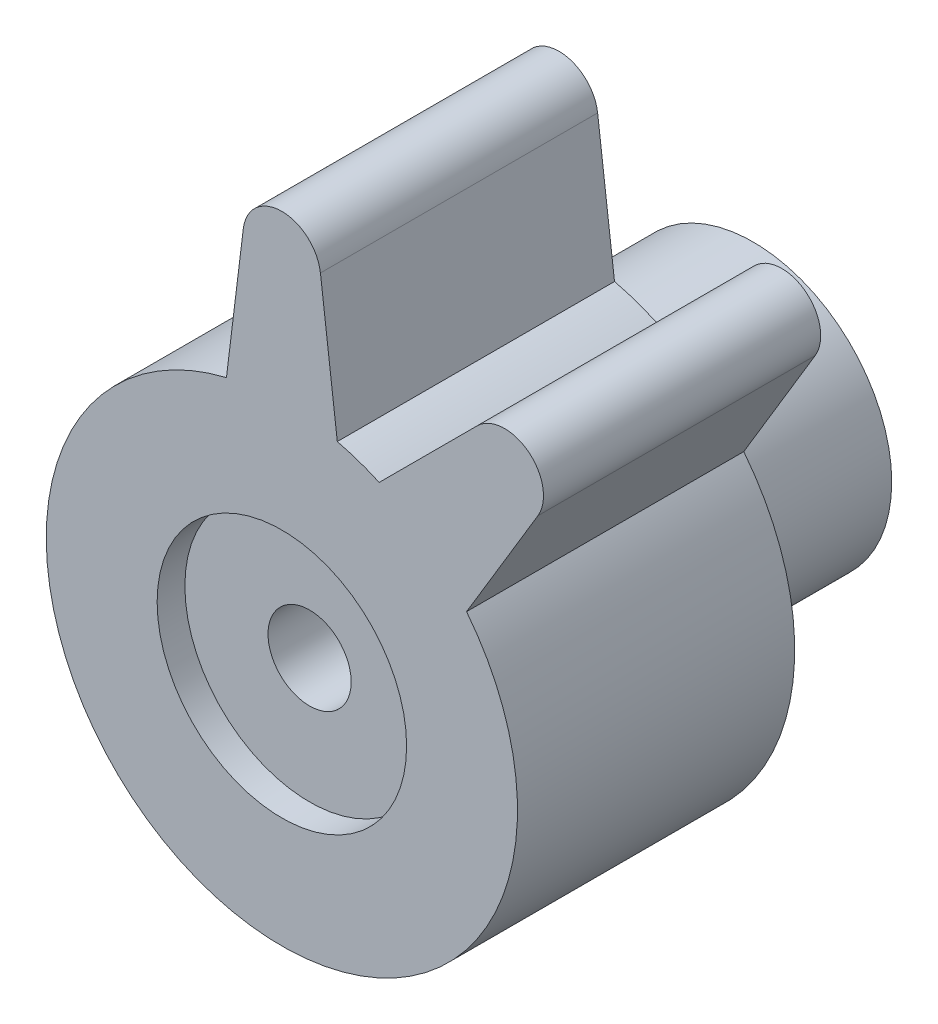
ISO-10303-21;
HEADER;
FILE_DESCRIPTION(('STEP AP214'),'2;1');
FILE_NAME('part.step','',(''),(''),'','','');
FILE_SCHEMA(('AUTOMOTIVE_DESIGN { 1 0 10303 214 1 1 1 1 }'));
ENDSEC;
DATA;
#1=APPLICATION_CONTEXT('core data for automotive mechanical design processes');
#2=APPLICATION_PROTOCOL_DEFINITION('international standard','automotive_design',2000,#1);
#3=PRODUCT_CONTEXT('',#1,'mechanical');
#4=PRODUCT('Part','Part','',(#3));
#5=PRODUCT_RELATED_PRODUCT_CATEGORY('part','',(#4));
#6=PRODUCT_DEFINITION_FORMATION('','',#4);
#7=PRODUCT_DEFINITION_CONTEXT('part definition',#1,'design');
#8=PRODUCT_DEFINITION('design','',#6,#7);
#9=PRODUCT_DEFINITION_SHAPE('','',#8);
#10=(LENGTH_UNIT() NAMED_UNIT(*) SI_UNIT(.MILLI.,.METRE.));
#11=(NAMED_UNIT(*) PLANE_ANGLE_UNIT() SI_UNIT($,.RADIAN.));
#12=(NAMED_UNIT(*) SI_UNIT($,.STERADIAN.) SOLID_ANGLE_UNIT());
#13=UNCERTAINTY_MEASURE_WITH_UNIT(LENGTH_MEASURE(1.E-05),#10,'distance_accuracy_value','');
#14=(GEOMETRIC_REPRESENTATION_CONTEXT(3) GLOBAL_UNCERTAINTY_ASSIGNED_CONTEXT((#13)) GLOBAL_UNIT_ASSIGNED_CONTEXT((#10,
#11,#12)) REPRESENTATION_CONTEXT('',''));
#15=CARTESIAN_POINT('',(0.,0.,0.));
#16=DIRECTION('',(0.,0.,1.));
#17=DIRECTION('',(1.,0.,0.));
#18=AXIS2_PLACEMENT_3D('',#15,#16,#17);
#19=CARTESIAN_POINT('',(0.,0.,10.));
#20=DIRECTION('',(0.,0.,-1.));
#21=DIRECTION('',(-1.,0.,0.));
#22=AXIS2_PLACEMENT_3D('',#19,#20,#21);
#23=CYLINDRICAL_SURFACE('',#22,1.5);
#24=CARTESIAN_POINT('',(0.,0.,0.));
#25=DIRECTION('',(0.,0.,1.));
#26=DIRECTION('',(1.,0.,0.));
#27=AXIS2_PLACEMENT_3D('',#24,#25,#26);
#28=CIRCLE('',#27,1.5);
#29=CARTESIAN_POINT('',(1.5,0.,0.));
#30=VERTEX_POINT('',#29);
#31=EDGE_CURVE('E149',#30,#30,#28,.T.);
#32=ORIENTED_EDGE('',*,*,#31,.F.);
#33=EDGE_LOOP('',(#32));
#34=FACE_BOUND('',#33,.T.);
#35=CARTESIAN_POINT('',(0.,0.,9.));
#36=DIRECTION('',(0.,0.,1.));
#37=DIRECTION('',(1.,0.,0.));
#38=AXIS2_PLACEMENT_3D('',#35,#36,#37);
#39=CIRCLE('',#38,1.5);
#40=CARTESIAN_POINT('',(1.5,0.,9.));
#41=VERTEX_POINT('',#40);
#42=EDGE_CURVE('E40',#41,#41,#39,.T.);
#43=ORIENTED_EDGE('',*,*,#42,.T.);
#44=EDGE_LOOP('',(#43));
#45=FACE_BOUND('',#44,.T.);
#46=ADVANCED_FACE('F37',(#34,#45),#23,.F.);
#47=CARTESIAN_POINT('',(0.,0.,0.));
#48=DIRECTION('',(0.,0.,1.));
#49=DIRECTION('',(1.,0.,0.));
#50=AXIS2_PLACEMENT_3D('',#47,#48,#49);
#51=PLANE('',#50);
#52=ORIENTED_EDGE('',*,*,#31,.T.);
#53=EDGE_LOOP('',(#52));
#54=FACE_BOUND('',#53,.T.);
#55=DIRECTION('',(1.,0.,0.));
#56=VECTOR('',#55,1.);
#57=CARTESIAN_POINT('',(0.,-2.6,0.));
#58=LINE('',#57,#56);
#59=CARTESIAN_POINT('',(-1.95,-2.6,0.));
#60=VERTEX_POINT('',#59);
#61=CARTESIAN_POINT('',(1.95,-2.6,0.));
#62=VERTEX_POINT('',#61);
#63=EDGE_CURVE('E51',#60,#62,#58,.T.);
#64=ORIENTED_EDGE('',*,*,#63,.F.);
#65=CARTESIAN_POINT('',(0.,0.,0.));
#66=DIRECTION('',(0.,0.,-1.));
#67=DIRECTION('',(-1.,0.,0.));
#68=AXIS2_PLACEMENT_3D('',#65,#66,#67);
#69=CIRCLE('',#68,3.25);
#70=EDGE_CURVE('E211',#60,#62,#69,.T.);
#71=ORIENTED_EDGE('',*,*,#70,.T.);
#72=EDGE_LOOP('',(#64,#71));
#73=FACE_BOUND('',#72,.T.);
#74=ADVANCED_FACE('F242',(#54,#73),#51,.F.);
#75=CARTESIAN_POINT('',(0.,0.,10.));
#76=DIRECTION('',(0.,0.,-1.));
#77=DIRECTION('',(-1.,0.,0.));
#78=AXIS2_PLACEMENT_3D('',#75,#76,#77);
#79=CYLINDRICAL_SURFACE('',#78,8.5);
#80=CARTESIAN_POINT('',(0.,0.,0.));
#81=DIRECTION('',(0.,0.,1.));
#82=DIRECTION('',(1.,0.,0.));
#83=AXIS2_PLACEMENT_3D('',#80,#81,#82);
#84=CIRCLE('',#83,8.5);
#85=CARTESIAN_POINT('',(-2.,8.26135582092915,0.));
#86=VERTEX_POINT('',#85);
#87=CARTESIAN_POINT('',(6.66222002011691,5.27871427561234,0.));
#88=VERTEX_POINT('',#87);
#89=EDGE_CURVE('E152',#86,#88,#84,.T.);
#90=ORIENTED_EDGE('',*,*,#89,.T.);
#91=DIRECTION('',(0.,0.,-1.));
#92=VECTOR('',#91,1.);
#93=CARTESIAN_POINT('',(6.66222002011691,5.27871427561234,10.));
#94=LINE('',#93,#92);
#95=CARTESIAN_POINT('',(6.66222002011691,5.27871427561234,10.));
#96=VERTEX_POINT('',#95);
#97=EDGE_CURVE('E45',#96,#88,#94,.T.);
#98=ORIENTED_EDGE('',*,*,#97,.F.);
#99=CARTESIAN_POINT('',(0.,0.,10.));
#100=DIRECTION('',(0.,0.,1.));
#101=DIRECTION('',(1.,0.,0.));
#102=AXIS2_PLACEMENT_3D('',#99,#100,#101);
#103=CIRCLE('',#102,8.5);
#104=CARTESIAN_POINT('',(-2.,8.26135582092915,10.));
#105=VERTEX_POINT('',#104);
#106=EDGE_CURVE('E170',#105,#96,#103,.T.);
#107=ORIENTED_EDGE('',*,*,#106,.F.);
#108=DIRECTION('',(0.,0.,-1.));
#109=VECTOR('',#108,1.);
#110=CARTESIAN_POINT('',(-2.,8.26135582092915,10.));
#111=LINE('',#110,#109);
#112=EDGE_CURVE('E60',#105,#86,#111,.T.);
#113=ORIENTED_EDGE('',*,*,#112,.T.);
#114=EDGE_LOOP('',(#90,#98,#107,#113));
#115=FACE_BOUND('',#114,.T.);
#116=ADVANCED_FACE('F183',(#115),#79,.T.);
#117=CARTESIAN_POINT('',(2.56455740077132,-1.54094154735917,10.));
#118=DIRECTION('',(-0.857167300702111,0.515038074910056,0.));
#119=DIRECTION('',(-0.515038074910056,-0.857167300702112,0.));
#120=AXIS2_PLACEMENT_3D('',#117,#118,#119);
#121=PLANE('',#120);
#122=DIRECTION('',(0.515038074910056,0.857167300702112,0.));
#123=VECTOR('',#122,1.);
#124=CARTESIAN_POINT('',(2.56455740077132,-1.54094154735917,0.));
#125=LINE('',#124,#123);
#126=CARTESIAN_POINT('',(9.23741039466719,9.56455077912289,0.));
#127=VERTEX_POINT('',#126);
#128=EDGE_CURVE('E155',#88,#127,#125,.T.);
#129=ORIENTED_EDGE('',*,*,#128,.T.);
#130=DIRECTION('',(0.,0.,-1.));
#131=VECTOR('',#130,1.);
#132=CARTESIAN_POINT('',(9.23741039466719,9.56455077912289,10.));
#133=LINE('',#132,#131);
#134=CARTESIAN_POINT('',(9.23741039466719,9.56455077912289,10.));
#135=VERTEX_POINT('',#134);
#136=EDGE_CURVE('E178',#135,#127,#133,.T.);
#137=ORIENTED_EDGE('',*,*,#136,.F.);
#138=DIRECTION('',(0.515038074910056,0.857167300702112,0.));
#139=VECTOR('',#138,1.);
#140=CARTESIAN_POINT('',(2.56455740077132,-1.54094154735917,10.));
#141=LINE('',#140,#139);
#142=EDGE_CURVE('E100',#96,#135,#141,.T.);
#143=ORIENTED_EDGE('',*,*,#142,.F.);
#144=ORIENTED_EDGE('',*,*,#97,.T.);
#145=EDGE_LOOP('',(#129,#137,#143,#144));
#146=FACE_BOUND('',#145,.T.);
#147=ADVANCED_FACE('F182',(#146),#121,.F.);
#148=CARTESIAN_POINT('',(8.03643599281354,10.2861690016569,10.));
#149=DIRECTION('',(0.,0.,-1.));
#150=DIRECTION('',(-1.,0.,0.));
#151=AXIS2_PLACEMENT_3D('',#148,#149,#150);
#152=CYLINDRICAL_SURFACE('',#151,1.40109684640317);
#153=CARTESIAN_POINT('',(8.03643599281354,10.2861690016569,0.));
#154=DIRECTION('',(0.,0.,1.));
#155=DIRECTION('',(1.,0.,0.));
#156=AXIS2_PLACEMENT_3D('',#153,#154,#155);
#157=CIRCLE('',#156,1.40109684640317);
#158=CARTESIAN_POINT('',(7.04571091162277,11.2768940828477,0.));
#159=VERTEX_POINT('',#158);
#160=EDGE_CURVE('E158',#127,#159,#157,.T.);
#161=ORIENTED_EDGE('',*,*,#160,.T.);
#162=DIRECTION('',(0.,0.,-1.));
#163=VECTOR('',#162,1.);
#164=CARTESIAN_POINT('',(7.04571091162277,11.2768940828477,10.));
#165=LINE('',#164,#163);
#166=CARTESIAN_POINT('',(7.04571091162277,11.2768940828477,10.));
#167=VERTEX_POINT('',#166);
#168=EDGE_CURVE('E176',#167,#159,#165,.T.);
#169=ORIENTED_EDGE('',*,*,#168,.F.);
#170=CARTESIAN_POINT('',(8.03643599281354,10.2861690016569,10.));
#171=DIRECTION('',(0.,0.,1.));
#172=DIRECTION('',(1.,0.,0.));
#173=AXIS2_PLACEMENT_3D('',#170,#171,#172);
#174=CIRCLE('',#173,1.40109684640317);
#175=EDGE_CURVE('E199',#135,#167,#174,.T.);
#176=ORIENTED_EDGE('',*,*,#175,.F.);
#177=ORIENTED_EDGE('',*,*,#136,.T.);
#178=EDGE_LOOP('',(#161,#169,#176,#177));
#179=FACE_BOUND('',#178,.T.);
#180=ADVANCED_FACE('F198',(#179),#152,.T.);
#181=CARTESIAN_POINT('',(-2.11559158561248,2.11559158561249,10.));
#182=DIRECTION('',(-0.707106781186546,0.707106781186549,0.));
#183=DIRECTION('',(-0.707106781186549,-0.707106781186546,0.));
#184=AXIS2_PLACEMENT_3D('',#181,#182,#183);
#185=PLANE('',#184);
#186=DIRECTION('',(0.707106781186549,0.707106781186546,0.));
#187=VECTOR('',#186,1.);
#188=CARTESIAN_POINT('',(-2.11559158561248,2.11559158561249,0.));
#189=LINE('',#188,#187);
#190=CARTESIAN_POINT('',(3.51017700569002,7.74136017691497,0.));
#191=VERTEX_POINT('',#190);
#192=EDGE_CURVE('E161',#191,#159,#189,.T.);
#193=ORIENTED_EDGE('',*,*,#192,.F.);
#194=DIRECTION('',(0.,0.,-1.));
#195=VECTOR('',#194,1.);
#196=CARTESIAN_POINT('',(3.51017700569002,7.74136017691497,10.));
#197=LINE('',#196,#195);
#198=CARTESIAN_POINT('',(3.51017700569002,7.74136017691497,10.));
#199=VERTEX_POINT('',#198);
#200=EDGE_CURVE('E174',#199,#191,#197,.T.);
#201=ORIENTED_EDGE('',*,*,#200,.F.);
#202=DIRECTION('',(0.707106781186549,0.707106781186546,0.));
#203=VECTOR('',#202,1.);
#204=CARTESIAN_POINT('',(-2.11559158561248,2.11559158561249,10.));
#205=LINE('',#204,#203);
#206=EDGE_CURVE('E195',#199,#167,#205,.T.);
#207=ORIENTED_EDGE('',*,*,#206,.T.);
#208=ORIENTED_EDGE('',*,*,#168,.T.);
#209=EDGE_LOOP('',(#193,#201,#207,#208));
#210=FACE_BOUND('',#209,.T.);
#211=ADVANCED_FACE('F192',(#210),#185,.T.);
#212=CARTESIAN_POINT('',(2.,8.26135582092915,0.));
#213=VERTEX_POINT('',#212);
#214=EDGE_CURVE('E156',#191,#213,#84,.T.);
#215=ORIENTED_EDGE('',*,*,#214,.T.);
#216=DIRECTION('',(0.,0.,-1.));
#217=VECTOR('',#216,1.);
#218=CARTESIAN_POINT('',(2.,8.26135582092915,10.));
#219=LINE('',#218,#217);
#220=CARTESIAN_POINT('',(2.,8.26135582092915,10.));
#221=VERTEX_POINT('',#220);
#222=EDGE_CURVE('E140',#221,#213,#219,.T.);
#223=ORIENTED_EDGE('',*,*,#222,.F.);
#224=EDGE_CURVE('E127',#199,#221,#103,.T.);
#225=ORIENTED_EDGE('',*,*,#224,.F.);
#226=ORIENTED_EDGE('',*,*,#200,.T.);
#227=EDGE_LOOP('',(#215,#223,#225,#226));
#228=FACE_BOUND('',#227,.T.);
#229=ADVANCED_FACE('F254',(#228),#79,.T.);
#230=CARTESIAN_POINT('',(2.96959715648726,0.364620682917803,10.));
#231=DIRECTION('',(-0.992546151641322,-0.121869343405148,0.));
#232=DIRECTION('',(0.121869343405148,-0.992546151641322,0.));
#233=AXIS2_PLACEMENT_3D('',#230,#231,#232);
#234=PLANE('',#233);
#235=DIRECTION('',(-0.121869343405148,0.992546151641322,0.));
#236=VECTOR('',#235,1.);
#237=CARTESIAN_POINT('',(2.96959715648726,0.364620682917803,0.));
#238=LINE('',#237,#236);
#239=CARTESIAN_POINT('',(1.39065328297426,13.2240865791358,0.));
#240=VERTEX_POINT('',#239);
#241=EDGE_CURVE('E136',#213,#240,#238,.T.);
#242=ORIENTED_EDGE('',*,*,#241,.T.);
#243=DIRECTION('',(0.,0.,-1.));
#244=VECTOR('',#243,1.);
#245=CARTESIAN_POINT('',(1.39065328297426,13.2240865791358,10.));
#246=LINE('',#245,#244);
#247=CARTESIAN_POINT('',(1.39065328297426,13.2240865791358,10.));
#248=VERTEX_POINT('',#247);
#249=EDGE_CURVE('E133',#248,#240,#246,.T.);
#250=ORIENTED_EDGE('',*,*,#249,.F.);
#251=DIRECTION('',(-0.121869343405148,0.992546151641322,0.));
#252=VECTOR('',#251,1.);
#253=CARTESIAN_POINT('',(2.96959715648726,0.364620682917803,10.));
#254=LINE('',#253,#252);
#255=EDGE_CURVE('E119',#221,#248,#254,.T.);
#256=ORIENTED_EDGE('',*,*,#255,.F.);
#257=ORIENTED_EDGE('',*,*,#222,.T.);
#258=EDGE_LOOP('',(#242,#250,#256,#257));
#259=FACE_BOUND('',#258,.T.);
#260=ADVANCED_FACE('F134',(#259),#234,.F.);
#261=CARTESIAN_POINT('',(0.,13.0533358264176,10.));
#262=DIRECTION('',(0.,0.,-1.));
#263=DIRECTION('',(-1.,0.,0.));
#264=AXIS2_PLACEMENT_3D('',#261,#262,#263);
#265=CYLINDRICAL_SURFACE('',#264,1.40109684640317);
#266=CARTESIAN_POINT('',(0.,13.0533358264176,0.));
#267=DIRECTION('',(0.,0.,1.));
#268=DIRECTION('',(1.,0.,0.));
#269=AXIS2_PLACEMENT_3D('',#266,#267,#268);
#270=CIRCLE('',#269,1.40109684640317);
#271=CARTESIAN_POINT('',(-1.39065328297426,13.2240865791358,0.));
#272=VERTEX_POINT('',#271);
#273=EDGE_CURVE('E165',#272,#240,#270,.F.);
#274=ORIENTED_EDGE('',*,*,#273,.F.);
#275=DIRECTION('',(0.,0.,-1.));
#276=VECTOR('',#275,1.);
#277=CARTESIAN_POINT('',(-1.39065328297426,13.2240865791358,10.));
#278=LINE('',#277,#276);
#279=CARTESIAN_POINT('',(-1.39065328297426,13.2240865791358,10.));
#280=VERTEX_POINT('',#279);
#281=EDGE_CURVE('E141',#280,#272,#278,.T.);
#282=ORIENTED_EDGE('',*,*,#281,.F.);
#283=CARTESIAN_POINT('',(0.,13.0533358264176,10.));
#284=DIRECTION('',(0.,0.,1.));
#285=DIRECTION('',(1.,0.,0.));
#286=AXIS2_PLACEMENT_3D('',#283,#284,#285);
#287=CIRCLE('',#286,1.40109684640317);
#288=EDGE_CURVE('E124',#280,#248,#287,.F.);
#289=ORIENTED_EDGE('',*,*,#288,.T.);
#290=ORIENTED_EDGE('',*,*,#249,.T.);
#291=EDGE_LOOP('',(#274,#282,#289,#290));
#292=FACE_BOUND('',#291,.T.);
#293=ADVANCED_FACE('F143',(#292),#265,.T.);
#294=CARTESIAN_POINT('',(-2.96959715648726,0.364620682917804,10.));
#295=DIRECTION('',(-0.992546151641322,0.121869343405148,0.));
#296=DIRECTION('',(-0.121869343405148,-0.992546151641322,0.));
#297=AXIS2_PLACEMENT_3D('',#294,#295,#296);
#298=PLANE('',#297);
#299=DIRECTION('',(0.121869343405148,0.992546151641322,0.));
#300=VECTOR('',#299,1.);
#301=CARTESIAN_POINT('',(-2.96959715648726,0.364620682917804,0.));
#302=LINE('',#301,#300);
#303=EDGE_CURVE('E167',#86,#272,#302,.T.);
#304=ORIENTED_EDGE('',*,*,#303,.F.);
#305=ORIENTED_EDGE('',*,*,#112,.F.);
#306=DIRECTION('',(0.121869343405148,0.992546151641322,0.));
#307=VECTOR('',#306,1.);
#308=CARTESIAN_POINT('',(-2.96959715648726,0.364620682917804,10.));
#309=LINE('',#308,#307);
#310=EDGE_CURVE('E144',#105,#280,#309,.T.);
#311=ORIENTED_EDGE('',*,*,#310,.T.);
#312=ORIENTED_EDGE('',*,*,#281,.T.);
#313=EDGE_LOOP('',(#304,#305,#311,#312));
#314=FACE_BOUND('',#313,.T.);
#315=ADVANCED_FACE('F187',(#314),#298,.T.);
#316=CARTESIAN_POINT('',(0.,0.,10.));
#317=DIRECTION('',(0.,0.,1.));
#318=DIRECTION('',(1.,0.,0.));
#319=AXIS2_PLACEMENT_3D('',#316,#317,#318);
#320=PLANE('',#319);
#321=CARTESIAN_POINT('',(0.,0.,10.));
#322=DIRECTION('',(0.,0.,1.));
#323=DIRECTION('',(1.,0.,0.));
#324=AXIS2_PLACEMENT_3D('',#321,#322,#323);
#325=CIRCLE('',#324,4.5);
#326=CARTESIAN_POINT('',(4.5,0.,10.));
#327=VERTEX_POINT('',#326);
#328=EDGE_CURVE('E220',#327,#327,#325,.T.);
#329=ORIENTED_EDGE('',*,*,#328,.F.);
#330=EDGE_LOOP('',(#329));
#331=FACE_BOUND('',#330,.T.);
#332=ORIENTED_EDGE('',*,*,#106,.T.);
#333=ORIENTED_EDGE('',*,*,#142,.T.);
#334=ORIENTED_EDGE('',*,*,#175,.T.);
#335=ORIENTED_EDGE('',*,*,#206,.F.);
#336=ORIENTED_EDGE('',*,*,#224,.T.);
#337=ORIENTED_EDGE('',*,*,#255,.T.);
#338=ORIENTED_EDGE('',*,*,#288,.F.);
#339=ORIENTED_EDGE('',*,*,#310,.F.);
#340=EDGE_LOOP('',(#332,#333,#334,#335,#336,#337,#338,#339));
#341=FACE_BOUND('',#340,.T.);
#342=ADVANCED_FACE('F121',(#331,#341),#320,.T.);
#343=CARTESIAN_POINT('',(0.,0.,0.));
#344=DIRECTION('',(0.,0.,1.));
#345=DIRECTION('',(1.,0.,0.));
#346=AXIS2_PLACEMENT_3D('',#343,#344,#345);
#347=CIRCLE('',#346,5.);
#348=CARTESIAN_POINT('',(5.,0.,0.));
#349=VERTEX_POINT('',#348);
#350=EDGE_CURVE('E11',#349,#349,#347,.F.);
#351=ORIENTED_EDGE('',*,*,#350,.F.);
#352=EDGE_LOOP('',(#351));
#353=FACE_BOUND('',#352,.T.);
#354=ORIENTED_EDGE('',*,*,#89,.F.);
#355=ORIENTED_EDGE('',*,*,#303,.T.);
#356=ORIENTED_EDGE('',*,*,#273,.T.);
#357=ORIENTED_EDGE('',*,*,#241,.F.);
#358=ORIENTED_EDGE('',*,*,#214,.F.);
#359=ORIENTED_EDGE('',*,*,#192,.T.);
#360=ORIENTED_EDGE('',*,*,#160,.F.);
#361=ORIENTED_EDGE('',*,*,#128,.F.);
#362=EDGE_LOOP('',(#354,#355,#356,#357,#358,#359,#360,#361));
#363=FACE_BOUND('',#362,.T.);
#364=ADVANCED_FACE('F185',(#353,#363),#51,.F.);
#365=CARTESIAN_POINT('',(0.,0.,-7.));
#366=DIRECTION('',(0.,0.,1.));
#367=DIRECTION('',(1.,0.,0.));
#368=AXIS2_PLACEMENT_3D('',#365,#366,#367);
#369=CYLINDRICAL_SURFACE('',#368,3.25);
#370=ORIENTED_EDGE('',*,*,#70,.F.);
#371=DIRECTION('',(0.,0.,1.));
#372=VECTOR('',#371,1.);
#373=CARTESIAN_POINT('',(-1.95,-2.6,-7.));
#374=LINE('',#373,#372);
#375=CARTESIAN_POINT('',(-1.95,-2.6,-7.));
#376=VERTEX_POINT('',#375);
#377=EDGE_CURVE('E153',#376,#60,#374,.T.);
#378=ORIENTED_EDGE('',*,*,#377,.F.);
#379=CARTESIAN_POINT('',(0.,0.,-7.));
#380=DIRECTION('',(0.,0.,-1.));
#381=DIRECTION('',(-1.,0.,0.));
#382=AXIS2_PLACEMENT_3D('',#379,#380,#381);
#383=CIRCLE('',#382,3.25);
#384=CARTESIAN_POINT('',(1.95,-2.6,-7.));
#385=VERTEX_POINT('',#384);
#386=EDGE_CURVE('E210',#376,#385,#383,.T.);
#387=ORIENTED_EDGE('',*,*,#386,.T.);
#388=DIRECTION('',(0.,0.,1.));
#389=VECTOR('',#388,1.);
#390=CARTESIAN_POINT('',(1.95,-2.6,-7.));
#391=LINE('',#390,#389);
#392=EDGE_CURVE('E205',#385,#62,#391,.T.);
#393=ORIENTED_EDGE('',*,*,#392,.T.);
#394=EDGE_LOOP('',(#370,#378,#387,#393));
#395=FACE_BOUND('',#394,.T.);
#396=ADVANCED_FACE('F258',(#395),#369,.F.);
#397=CARTESIAN_POINT('',(0.,-2.6,-7.));
#398=DIRECTION('',(0.,-1.,0.));
#399=DIRECTION('',(0.,0.,-1.));
#400=AXIS2_PLACEMENT_3D('',#397,#398,#399);
#401=PLANE('',#400);
#402=ORIENTED_EDGE('',*,*,#63,.T.);
#403=ORIENTED_EDGE('',*,*,#392,.F.);
#404=DIRECTION('',(1.,0.,0.));
#405=VECTOR('',#404,1.);
#406=CARTESIAN_POINT('',(0.,-2.6,-7.));
#407=LINE('',#406,#405);
#408=EDGE_CURVE('E215',#376,#385,#407,.T.);
#409=ORIENTED_EDGE('',*,*,#408,.F.);
#410=ORIENTED_EDGE('',*,*,#377,.T.);
#411=EDGE_LOOP('',(#402,#403,#409,#410));
#412=FACE_BOUND('',#411,.T.);
#413=ADVANCED_FACE('F264',(#412),#401,.F.);
#414=CARTESIAN_POINT('',(0.,0.,-7.));
#415=DIRECTION('',(0.,0.,1.));
#416=DIRECTION('',(1.,0.,0.));
#417=AXIS2_PLACEMENT_3D('',#414,#415,#416);
#418=CYLINDRICAL_SURFACE('',#417,5.);
#419=CARTESIAN_POINT('',(0.,0.,-7.));
#420=DIRECTION('',(0.,0.,-1.));
#421=DIRECTION('',(-1.,0.,0.));
#422=AXIS2_PLACEMENT_3D('',#419,#420,#421);
#423=CIRCLE('',#422,5.);
#424=CARTESIAN_POINT('',(-5.,0.,-7.));
#425=VERTEX_POINT('',#424);
#426=EDGE_CURVE('E208',#425,#425,#423,.T.);
#427=ORIENTED_EDGE('',*,*,#426,.F.);
#428=EDGE_LOOP('',(#427));
#429=FACE_BOUND('',#428,.T.);
#430=ORIENTED_EDGE('',*,*,#350,.T.);
#431=EDGE_LOOP('',(#430));
#432=FACE_BOUND('',#431,.T.);
#433=ADVANCED_FACE('F270',(#429,#432),#418,.T.);
#434=CARTESIAN_POINT('',(0.,0.,-7.));
#435=DIRECTION('',(0.,0.,-1.));
#436=DIRECTION('',(-1.,0.,0.));
#437=AXIS2_PLACEMENT_3D('',#434,#435,#436);
#438=PLANE('',#437);
#439=ORIENTED_EDGE('',*,*,#386,.F.);
#440=ORIENTED_EDGE('',*,*,#408,.T.);
#441=EDGE_LOOP('',(#439,#440));
#442=FACE_BOUND('',#441,.T.);
#443=ORIENTED_EDGE('',*,*,#426,.T.);
#444=EDGE_LOOP('',(#443));
#445=FACE_BOUND('',#444,.T.);
#446=ADVANCED_FACE('F238',(#442,#445),#438,.T.);
#447=CARTESIAN_POINT('',(0.,0.,9.));
#448=DIRECTION('',(0.,0.,1.));
#449=DIRECTION('',(1.,0.,0.));
#450=AXIS2_PLACEMENT_3D('',#447,#448,#449);
#451=CYLINDRICAL_SURFACE('',#450,4.5);
#452=CARTESIAN_POINT('',(0.,0.,9.));
#453=DIRECTION('',(0.,0.,1.));
#454=DIRECTION('',(1.,0.,0.));
#455=AXIS2_PLACEMENT_3D('',#452,#453,#454);
#456=CIRCLE('',#455,4.5);
#457=CARTESIAN_POINT('',(4.5,0.,9.));
#458=VERTEX_POINT('',#457);
#459=EDGE_CURVE('E223',#458,#458,#456,.T.);
#460=ORIENTED_EDGE('',*,*,#459,.F.);
#461=EDGE_LOOP('',(#460));
#462=FACE_BOUND('',#461,.T.);
#463=ORIENTED_EDGE('',*,*,#328,.T.);
#464=EDGE_LOOP('',(#463));
#465=FACE_BOUND('',#464,.T.);
#466=ADVANCED_FACE('F233',(#462,#465),#451,.F.);
#467=CARTESIAN_POINT('',(0.,0.,9.));
#468=DIRECTION('',(0.,0.,1.));
#469=DIRECTION('',(1.,0.,0.));
#470=AXIS2_PLACEMENT_3D('',#467,#468,#469);
#471=PLANE('',#470);
#472=ORIENTED_EDGE('',*,*,#42,.F.);
#473=EDGE_LOOP('',(#472));
#474=FACE_BOUND('',#473,.T.);
#475=ORIENTED_EDGE('',*,*,#459,.T.);
#476=EDGE_LOOP('',(#475));
#477=FACE_BOUND('',#476,.T.);
#478=ADVANCED_FACE('F231',(#474,#477),#471,.T.);
#479=CLOSED_SHELL('',(#46,#74,#116,#147,#180,#211,#229,#260,#293,#315,#342,#364,#396,#413,#433,
#446,#466,#478));
#480=MANIFOLD_SOLID_BREP('B2',#479);
#481=ADVANCED_BREP_SHAPE_REPRESENTATION('',(#18,#480),#14);
#482=SHAPE_DEFINITION_REPRESENTATION(#9,#481);
ENDSEC;
END-ISO-10303-21;
